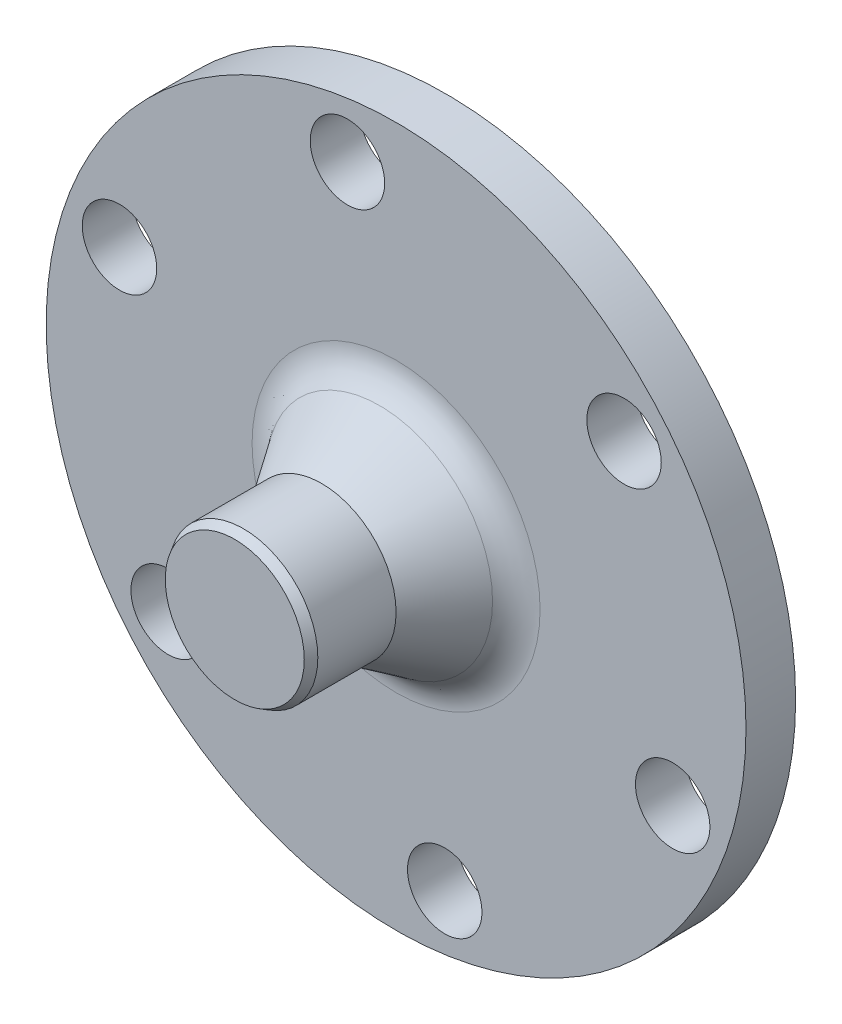
ISO-10303-21;
HEADER;
FILE_DESCRIPTION(('STEP AP214'),'2;1');
FILE_NAME('part.step','',(''),(''),'','','');
FILE_SCHEMA(('AUTOMOTIVE_DESIGN { 1 0 10303 214 1 1 1 1 }'));
ENDSEC;
DATA;
#1=APPLICATION_CONTEXT('core data for automotive mechanical design processes');
#2=APPLICATION_PROTOCOL_DEFINITION('international standard','automotive_design',2000,#1);
#3=PRODUCT_CONTEXT('',#1,'mechanical');
#4=PRODUCT('Part','Part','',(#3));
#5=PRODUCT_RELATED_PRODUCT_CATEGORY('part','',(#4));
#6=PRODUCT_DEFINITION_FORMATION('','',#4);
#7=PRODUCT_DEFINITION_CONTEXT('part definition',#1,'design');
#8=PRODUCT_DEFINITION('design','',#6,#7);
#9=PRODUCT_DEFINITION_SHAPE('','',#8);
#10=(LENGTH_UNIT() NAMED_UNIT(*) SI_UNIT(.MILLI.,.METRE.));
#11=(NAMED_UNIT(*) PLANE_ANGLE_UNIT() SI_UNIT($,.RADIAN.));
#12=(NAMED_UNIT(*) SI_UNIT($,.STERADIAN.) SOLID_ANGLE_UNIT());
#13=UNCERTAINTY_MEASURE_WITH_UNIT(LENGTH_MEASURE(1.E-05),#10,'distance_accuracy_value','');
#14=(GEOMETRIC_REPRESENTATION_CONTEXT(3) GLOBAL_UNCERTAINTY_ASSIGNED_CONTEXT((#13)) GLOBAL_UNIT_ASSIGNED_CONTEXT((#10,
#11,#12)) REPRESENTATION_CONTEXT('',''));
#15=CARTESIAN_POINT('',(0.,0.,0.));
#16=DIRECTION('',(0.,0.,1.));
#17=DIRECTION('',(1.,0.,0.));
#18=AXIS2_PLACEMENT_3D('',#15,#16,#17);
#19=CARTESIAN_POINT('',(0.,-62.1814213562373,4.));
#20=DIRECTION('',(0.,0.,1.));
#21=DIRECTION('',(1.,0.,0.));
#22=AXIS2_PLACEMENT_3D('',#19,#20,#21);
#23=PLANE('',#22);
#24=CARTESIAN_POINT('',(0.,0.,4.));
#25=DIRECTION('',(0.,0.,1.));
#26=DIRECTION('',(1.,0.,0.));
#27=AXIS2_PLACEMENT_3D('',#24,#25,#26);
#28=CIRCLE('',#27,11.605551275464);
#29=CARTESIAN_POINT('',(11.605551275464,0.,4.));
#30=VERTEX_POINT('',#29);
#31=EDGE_CURVE('E56',#30,#30,#28,.F.);
#32=ORIENTED_EDGE('',*,*,#31,.T.);
#33=EDGE_LOOP('',(#32));
#34=FACE_BOUND('',#33,.T.);
#35=CARTESIAN_POINT('',(-18.3698033364675,-15.1324262885866,4.));
#36=DIRECTION('',(0.,0.,1.));
#37=DIRECTION('',(1.,0.,0.));
#38=AXIS2_PLACEMENT_3D('',#35,#36,#37);
#39=CIRCLE('',#38,3.);
#40=CARTESIAN_POINT('',(-15.3698033364675,-15.1324262885866,4.));
#41=VERTEX_POINT('',#40);
#42=EDGE_CURVE('E64',#41,#41,#39,.T.);
#43=ORIENTED_EDGE('',*,*,#42,.F.);
#44=EDGE_LOOP('',(#43));
#45=FACE_BOUND('',#44,.T.);
#46=CARTESIAN_POINT('',(3.92016391857776,-23.4749294961983,4.));
#47=DIRECTION('',(0.,0.,1.));
#48=DIRECTION('',(1.,0.,0.));
#49=AXIS2_PLACEMENT_3D('',#46,#47,#48);
#50=CIRCLE('',#49,3.);
#51=CARTESIAN_POINT('',(6.92016391857776,-23.4749294961983,4.));
#52=VERTEX_POINT('',#51);
#53=EDGE_CURVE('E89',#52,#52,#50,.T.);
#54=ORIENTED_EDGE('',*,*,#53,.F.);
#55=EDGE_LOOP('',(#54));
#56=FACE_BOUND('',#55,.T.);
#57=CARTESIAN_POINT('',(22.2899672550453,-8.34250320761168,4.));
#58=DIRECTION('',(0.,0.,1.));
#59=DIRECTION('',(1.,0.,0.));
#60=AXIS2_PLACEMENT_3D('',#57,#58,#59);
#61=CIRCLE('',#60,3.);
#62=CARTESIAN_POINT('',(25.2899672550453,-8.34250320761168,4.));
#63=VERTEX_POINT('',#62);
#64=EDGE_CURVE('E92',#63,#63,#61,.T.);
#65=ORIENTED_EDGE('',*,*,#64,.F.);
#66=EDGE_LOOP('',(#65));
#67=FACE_BOUND('',#66,.T.);
#68=CARTESIAN_POINT('',(18.3698033364675,15.1324262885866,4.));
#69=DIRECTION('',(0.,0.,1.));
#70=DIRECTION('',(1.,0.,0.));
#71=AXIS2_PLACEMENT_3D('',#68,#69,#70);
#72=CIRCLE('',#71,3.);
#73=CARTESIAN_POINT('',(21.3698033364675,15.1324262885866,4.));
#74=VERTEX_POINT('',#73);
#75=EDGE_CURVE('E95',#74,#74,#72,.T.);
#76=ORIENTED_EDGE('',*,*,#75,.F.);
#77=EDGE_LOOP('',(#76));
#78=FACE_BOUND('',#77,.T.);
#79=CARTESIAN_POINT('',(-3.92016391857775,23.4749294961983,4.));
#80=DIRECTION('',(0.,0.,1.));
#81=DIRECTION('',(1.,0.,0.));
#82=AXIS2_PLACEMENT_3D('',#79,#80,#81);
#83=CIRCLE('',#82,3.);
#84=CARTESIAN_POINT('',(-0.920163918577748,23.4749294961983,4.));
#85=VERTEX_POINT('',#84);
#86=EDGE_CURVE('E98',#85,#85,#83,.T.);
#87=ORIENTED_EDGE('',*,*,#86,.F.);
#88=EDGE_LOOP('',(#87));
#89=FACE_BOUND('',#88,.T.);
#90=CARTESIAN_POINT('',(-22.2899672550452,8.34250320761168,4.));
#91=DIRECTION('',(0.,0.,1.));
#92=DIRECTION('',(1.,0.,0.));
#93=AXIS2_PLACEMENT_3D('',#90,#91,#92);
#94=CIRCLE('',#93,3.);
#95=CARTESIAN_POINT('',(-19.2899672550452,8.34250320761168,4.));
#96=VERTEX_POINT('',#95);
#97=EDGE_CURVE('E101',#96,#96,#94,.T.);
#98=ORIENTED_EDGE('',*,*,#97,.F.);
#99=EDGE_LOOP('',(#98));
#100=FACE_BOUND('',#99,.T.);
#101=CARTESIAN_POINT('',(0.,0.,4.));
#102=DIRECTION('',(0.,0.,1.));
#103=DIRECTION('',(1.,0.,0.));
#104=AXIS2_PLACEMENT_3D('',#101,#102,#103);
#105=CIRCLE('',#104,28.2);
#106=CARTESIAN_POINT('',(28.2,0.,4.));
#107=VERTEX_POINT('',#106);
#108=EDGE_CURVE('E68',#107,#107,#105,.T.);
#109=ORIENTED_EDGE('',*,*,#108,.T.);
#110=EDGE_LOOP('',(#109));
#111=FACE_BOUND('',#110,.T.);
#112=ADVANCED_FACE('F41',(#34,#45,#56,#67,#78,#89,#100,#111),#23,.T.);
#113=CARTESIAN_POINT('',(3.92016391857776,-23.4749294961983,4.));
#114=DIRECTION('',(0.,0.,-1.));
#115=DIRECTION('',(-1.,0.,0.));
#116=AXIS2_PLACEMENT_3D('',#113,#114,#115);
#117=CYLINDRICAL_SURFACE('',#116,3.);
#118=ORIENTED_EDGE('',*,*,#53,.T.);
#119=EDGE_LOOP('',(#118));
#120=FACE_BOUND('',#119,.T.);
#121=CARTESIAN_POINT('',(3.92016391857776,-23.4749294961983,0.));
#122=DIRECTION('',(0.,0.,1.));
#123=DIRECTION('',(1.,0.,0.));
#124=AXIS2_PLACEMENT_3D('',#121,#122,#123);
#125=CIRCLE('',#124,3.);
#126=CARTESIAN_POINT('',(6.92016391857776,-23.4749294961983,0.));
#127=VERTEX_POINT('',#126);
#128=EDGE_CURVE('E69',#127,#127,#125,.T.);
#129=ORIENTED_EDGE('',*,*,#128,.F.);
#130=EDGE_LOOP('',(#129));
#131=FACE_BOUND('',#130,.T.);
#132=ADVANCED_FACE('F132',(#120,#131),#117,.F.);
#133=CARTESIAN_POINT('',(22.2899672550453,-8.34250320761168,4.));
#134=DIRECTION('',(0.,0.,-1.));
#135=DIRECTION('',(-1.,0.,0.));
#136=AXIS2_PLACEMENT_3D('',#133,#134,#135);
#137=CYLINDRICAL_SURFACE('',#136,3.);
#138=ORIENTED_EDGE('',*,*,#64,.T.);
#139=EDGE_LOOP('',(#138));
#140=FACE_BOUND('',#139,.T.);
#141=CARTESIAN_POINT('',(22.2899672550453,-8.34250320761168,0.));
#142=DIRECTION('',(0.,0.,1.));
#143=DIRECTION('',(1.,0.,0.));
#144=AXIS2_PLACEMENT_3D('',#141,#142,#143);
#145=CIRCLE('',#144,3.);
#146=CARTESIAN_POINT('',(25.2899672550453,-8.34250320761168,0.));
#147=VERTEX_POINT('',#146);
#148=EDGE_CURVE('E72',#147,#147,#145,.T.);
#149=ORIENTED_EDGE('',*,*,#148,.F.);
#150=EDGE_LOOP('',(#149));
#151=FACE_BOUND('',#150,.T.);
#152=ADVANCED_FACE('F137',(#140,#151),#137,.F.);
#153=CARTESIAN_POINT('',(18.3698033364675,15.1324262885866,4.));
#154=DIRECTION('',(0.,0.,-1.));
#155=DIRECTION('',(-1.,0.,0.));
#156=AXIS2_PLACEMENT_3D('',#153,#154,#155);
#157=CYLINDRICAL_SURFACE('',#156,3.);
#158=ORIENTED_EDGE('',*,*,#75,.T.);
#159=EDGE_LOOP('',(#158));
#160=FACE_BOUND('',#159,.T.);
#161=CARTESIAN_POINT('',(18.3698033364675,15.1324262885866,0.));
#162=DIRECTION('',(0.,0.,1.));
#163=DIRECTION('',(1.,0.,0.));
#164=AXIS2_PLACEMENT_3D('',#161,#162,#163);
#165=CIRCLE('',#164,3.);
#166=CARTESIAN_POINT('',(21.3698033364675,15.1324262885866,0.));
#167=VERTEX_POINT('',#166);
#168=EDGE_CURVE('E75',#167,#167,#165,.T.);
#169=ORIENTED_EDGE('',*,*,#168,.F.);
#170=EDGE_LOOP('',(#169));
#171=FACE_BOUND('',#170,.T.);
#172=ADVANCED_FACE('F162',(#160,#171),#157,.F.);
#173=CARTESIAN_POINT('',(-3.92016391857775,23.4749294961983,4.));
#174=DIRECTION('',(0.,0.,-1.));
#175=DIRECTION('',(-1.,0.,0.));
#176=AXIS2_PLACEMENT_3D('',#173,#174,#175);
#177=CYLINDRICAL_SURFACE('',#176,3.);
#178=ORIENTED_EDGE('',*,*,#86,.T.);
#179=EDGE_LOOP('',(#178));
#180=FACE_BOUND('',#179,.T.);
#181=CARTESIAN_POINT('',(-3.92016391857775,23.4749294961983,0.));
#182=DIRECTION('',(0.,0.,1.));
#183=DIRECTION('',(1.,0.,0.));
#184=AXIS2_PLACEMENT_3D('',#181,#182,#183);
#185=CIRCLE('',#184,3.);
#186=CARTESIAN_POINT('',(-0.920163918577748,23.4749294961983,0.));
#187=VERTEX_POINT('',#186);
#188=EDGE_CURVE('E78',#187,#187,#185,.T.);
#189=ORIENTED_EDGE('',*,*,#188,.F.);
#190=EDGE_LOOP('',(#189));
#191=FACE_BOUND('',#190,.T.);
#192=ADVANCED_FACE('F158',(#180,#191),#177,.F.);
#193=CARTESIAN_POINT('',(-22.2899672550452,8.34250320761168,4.));
#194=DIRECTION('',(0.,0.,-1.));
#195=DIRECTION('',(-1.,0.,0.));
#196=AXIS2_PLACEMENT_3D('',#193,#194,#195);
#197=CYLINDRICAL_SURFACE('',#196,3.);
#198=ORIENTED_EDGE('',*,*,#97,.T.);
#199=EDGE_LOOP('',(#198));
#200=FACE_BOUND('',#199,.T.);
#201=CARTESIAN_POINT('',(-22.2899672550452,8.34250320761168,0.));
#202=DIRECTION('',(0.,0.,1.));
#203=DIRECTION('',(1.,0.,0.));
#204=AXIS2_PLACEMENT_3D('',#201,#202,#203);
#205=CIRCLE('',#204,3.);
#206=CARTESIAN_POINT('',(-19.2899672550452,8.34250320761168,0.));
#207=VERTEX_POINT('',#206);
#208=EDGE_CURVE('E81',#207,#207,#205,.T.);
#209=ORIENTED_EDGE('',*,*,#208,.F.);
#210=EDGE_LOOP('',(#209));
#211=FACE_BOUND('',#210,.T.);
#212=ADVANCED_FACE('F112',(#200,#211),#197,.F.);
#213=CARTESIAN_POINT('',(0.,0.,4.));
#214=DIRECTION('',(0.,0.,-1.));
#215=DIRECTION('',(-1.,0.,0.));
#216=AXIS2_PLACEMENT_3D('',#213,#214,#215);
#217=CYLINDRICAL_SURFACE('',#216,28.2);
#218=ORIENTED_EDGE('',*,*,#108,.F.);
#219=EDGE_LOOP('',(#218));
#220=FACE_BOUND('',#219,.T.);
#221=CARTESIAN_POINT('',(0.,0.,0.));
#222=DIRECTION('',(0.,0.,1.));
#223=DIRECTION('',(1.,0.,0.));
#224=AXIS2_PLACEMENT_3D('',#221,#222,#223);
#225=CIRCLE('',#224,28.2);
#226=CARTESIAN_POINT('',(28.2,0.,0.));
#227=VERTEX_POINT('',#226);
#228=EDGE_CURVE('E84',#227,#227,#225,.T.);
#229=ORIENTED_EDGE('',*,*,#228,.T.);
#230=EDGE_LOOP('',(#229));
#231=FACE_BOUND('',#230,.T.);
#232=ADVANCED_FACE('F108',(#220,#231),#217,.T.);
#233=CARTESIAN_POINT('',(-18.3698033364675,-15.1324262885866,4.));
#234=DIRECTION('',(0.,0.,-1.));
#235=DIRECTION('',(-1.,0.,0.));
#236=AXIS2_PLACEMENT_3D('',#233,#234,#235);
#237=CYLINDRICAL_SURFACE('',#236,3.);
#238=ORIENTED_EDGE('',*,*,#42,.T.);
#239=EDGE_LOOP('',(#238));
#240=FACE_BOUND('',#239,.T.);
#241=CARTESIAN_POINT('',(-18.3698033364675,-15.1324262885866,0.));
#242=DIRECTION('',(0.,0.,1.));
#243=DIRECTION('',(1.,0.,0.));
#244=AXIS2_PLACEMENT_3D('',#241,#242,#243);
#245=CIRCLE('',#244,3.);
#246=CARTESIAN_POINT('',(-15.3698033364675,-15.1324262885866,0.));
#247=VERTEX_POINT('',#246);
#248=EDGE_CURVE('E65',#247,#247,#245,.T.);
#249=ORIENTED_EDGE('',*,*,#248,.F.);
#250=EDGE_LOOP('',(#249));
#251=FACE_BOUND('',#250,.T.);
#252=ADVANCED_FACE('F111',(#240,#251),#237,.F.);
#253=CARTESIAN_POINT('',(0.,-62.1814213562373,0.));
#254=DIRECTION('',(0.,0.,1.));
#255=DIRECTION('',(1.,0.,0.));
#256=AXIS2_PLACEMENT_3D('',#253,#254,#255);
#257=PLANE('',#256);
#258=ORIENTED_EDGE('',*,*,#248,.T.);
#259=EDGE_LOOP('',(#258));
#260=FACE_BOUND('',#259,.T.);
#261=ORIENTED_EDGE('',*,*,#128,.T.);
#262=EDGE_LOOP('',(#261));
#263=FACE_BOUND('',#262,.T.);
#264=ORIENTED_EDGE('',*,*,#148,.T.);
#265=EDGE_LOOP('',(#264));
#266=FACE_BOUND('',#265,.T.);
#267=ORIENTED_EDGE('',*,*,#168,.T.);
#268=EDGE_LOOP('',(#267));
#269=FACE_BOUND('',#268,.T.);
#270=ORIENTED_EDGE('',*,*,#188,.T.);
#271=EDGE_LOOP('',(#270));
#272=FACE_BOUND('',#271,.T.);
#273=ORIENTED_EDGE('',*,*,#208,.T.);
#274=EDGE_LOOP('',(#273));
#275=FACE_BOUND('',#274,.T.);
#276=ORIENTED_EDGE('',*,*,#228,.F.);
#277=EDGE_LOOP('',(#276));
#278=FACE_BOUND('',#277,.T.);
#279=ADVANCED_FACE('F116',(#260,#263,#266,#269,#272,#275,#278),#257,.F.);
#280=CARTESIAN_POINT('',(0.,0.,17.));
#281=DIRECTION('',(0.,0.,-1.));
#282=DIRECTION('',(-1.,0.,0.));
#283=AXIS2_PLACEMENT_3D('',#280,#281,#282);
#284=CYLINDRICAL_SURFACE('',#283,6.);
#285=CARTESIAN_POINT('',(0.,0.,16.3071796769724));
#286=DIRECTION('',(0.,0.,1.));
#287=DIRECTION('',(1.,0.,0.));
#288=AXIS2_PLACEMENT_3D('',#285,#286,#287);
#289=CIRCLE('',#288,6.);
#290=CARTESIAN_POINT('',(6.,0.,16.3071796769724));
#291=VERTEX_POINT('',#290);
#292=EDGE_CURVE('E11',#291,#291,#289,.F.);
#293=ORIENTED_EDGE('',*,*,#292,.T.);
#294=EDGE_LOOP('',(#293));
#295=FACE_BOUND('',#294,.T.);
#296=CARTESIAN_POINT('',(0.,0.,9.99999999999994));
#297=DIRECTION('',(0.,0.,1.));
#298=DIRECTION('',(1.,0.,0.));
#299=AXIS2_PLACEMENT_3D('',#296,#297,#298);
#300=CIRCLE('',#299,6.);
#301=CARTESIAN_POINT('',(6.,0.,9.99999999999994));
#302=VERTEX_POINT('',#301);
#303=EDGE_CURVE('E61',#302,#302,#300,.T.);
#304=ORIENTED_EDGE('',*,*,#303,.T.);
#305=EDGE_LOOP('',(#304));
#306=FACE_BOUND('',#305,.T.);
#307=ADVANCED_FACE('F118',(#295,#306),#284,.T.);
#308=CARTESIAN_POINT('',(0.,-62.1814213562373,17.));
#309=DIRECTION('',(0.,0.,1.));
#310=DIRECTION('',(1.,0.,0.));
#311=AXIS2_PLACEMENT_3D('',#308,#309,#310);
#312=PLANE('',#311);
#313=CARTESIAN_POINT('',(0.,0.,17.));
#314=DIRECTION('',(0.,0.,1.));
#315=DIRECTION('',(1.,0.,0.));
#316=AXIS2_PLACEMENT_3D('',#313,#314,#315);
#317=CIRCLE('',#316,5.59999999999998);
#318=CARTESIAN_POINT('',(5.59999999999998,0.,17.));
#319=VERTEX_POINT('',#318);
#320=EDGE_CURVE('E48',#319,#319,#317,.T.);
#321=ORIENTED_EDGE('',*,*,#320,.T.);
#322=EDGE_LOOP('',(#321));
#323=FACE_BOUND('',#322,.T.);
#324=ADVANCED_FACE('F125',(#323),#312,.T.);
#325=CARTESIAN_POINT('',(0.,0.,4.));
#326=DIRECTION('',(0.,0.,-1.));
#327=DIRECTION('',(-1.,0.,0.));
#328=AXIS2_PLACEMENT_3D('',#325,#326,#327);
#329=CONICAL_SURFACE('',#328,9.99999999999997,0.588002603547569);
#330=CARTESIAN_POINT('',(0.,0.,5.33589941132431));
#331=DIRECTION('',(0.,0.,1.));
#332=DIRECTION('',(1.,0.,0.));
#333=AXIS2_PLACEMENT_3D('',#330,#331,#332);
#334=CIRCLE('',#333,9.10940039245043);
#335=CARTESIAN_POINT('',(9.10940039245043,0.,5.33589941132431));
#336=VERTEX_POINT('',#335);
#337=EDGE_CURVE('E52',#336,#336,#334,.T.);
#338=ORIENTED_EDGE('',*,*,#337,.T.);
#339=EDGE_LOOP('',(#338));
#340=FACE_BOUND('',#339,.T.);
#341=ORIENTED_EDGE('',*,*,#303,.F.);
#342=EDGE_LOOP('',(#341));
#343=FACE_BOUND('',#342,.T.);
#344=ADVANCED_FACE('F143',(#340,#343),#329,.T.);
#345=CARTESIAN_POINT('',(0.,0.,7.));
#346=DIRECTION('',(0.,0.,1.));
#347=DIRECTION('',(1.,0.,0.));
#348=AXIS2_PLACEMENT_3D('',#345,#346,#347);
#349=TOROIDAL_SURFACE('',#348,11.605551275464,3.);
#350=ORIENTED_EDGE('',*,*,#337,.F.);
#351=EDGE_LOOP('',(#350));
#352=FACE_BOUND('',#351,.T.);
#353=ORIENTED_EDGE('',*,*,#31,.F.);
#354=EDGE_LOOP('',(#353));
#355=FACE_BOUND('',#354,.T.);
#356=ADVANCED_FACE('F147',(#352,#355),#349,.F.);
#357=CARTESIAN_POINT('',(0.,0.,17.));
#358=DIRECTION('',(0.,0.,-1.));
#359=DIRECTION('',(-1.,0.,0.));
#360=AXIS2_PLACEMENT_3D('',#357,#358,#359);
#361=CONICAL_SURFACE('',#360,5.59999999999998,0.523598775598299);
#362=ORIENTED_EDGE('',*,*,#292,.F.);
#363=EDGE_LOOP('',(#362));
#364=FACE_BOUND('',#363,.T.);
#365=ORIENTED_EDGE('',*,*,#320,.F.);
#366=EDGE_LOOP('',(#365));
#367=FACE_BOUND('',#366,.T.);
#368=ADVANCED_FACE('F43',(#364,#367),#361,.T.);
#369=CLOSED_SHELL('',(#112,#132,#152,#172,#192,#212,#232,#252,#279,#307,#324,#344,#356,#368));
#370=MANIFOLD_SOLID_BREP('B2',#369);
#371=ADVANCED_BREP_SHAPE_REPRESENTATION('',(#18,#370),#14);
#372=SHAPE_DEFINITION_REPRESENTATION(#9,#371);
ENDSEC;
END-ISO-10303-21;
